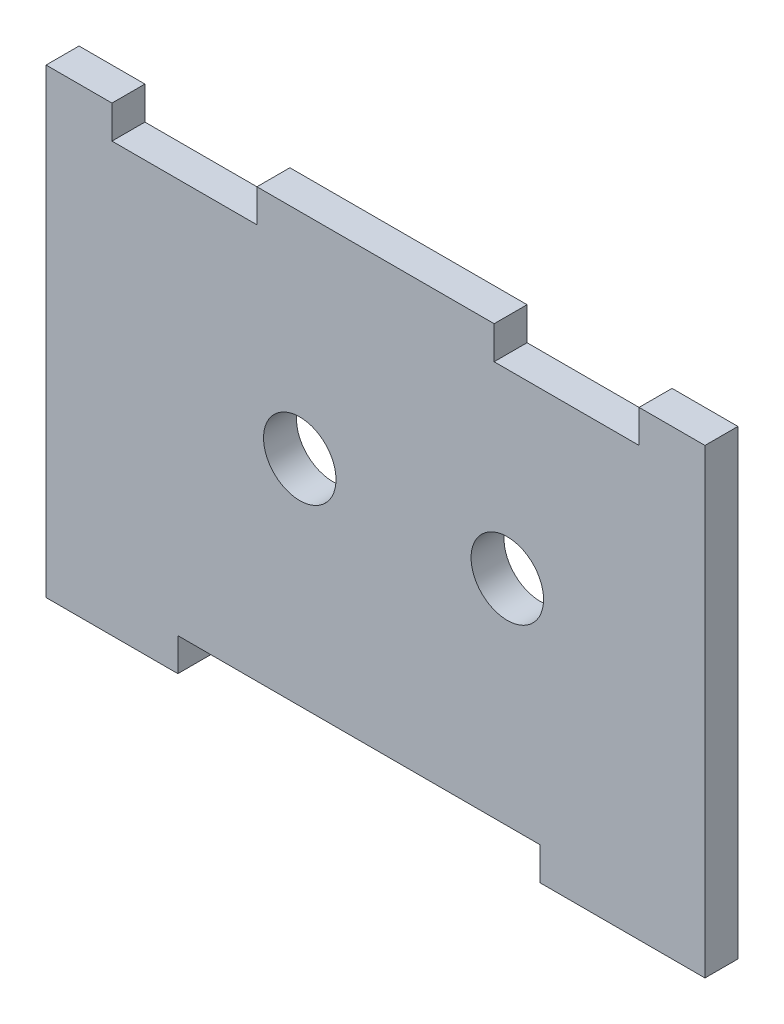
ISO-10303-21;
HEADER;
FILE_DESCRIPTION(('STEP AP214'),'2;1');
FILE_NAME('part.step','',(''),(''),'','','');
FILE_SCHEMA(('AUTOMOTIVE_DESIGN { 1 0 10303 214 1 1 1 1 }'));
ENDSEC;
DATA;
#1=APPLICATION_CONTEXT('core data for automotive mechanical design processes');
#2=APPLICATION_PROTOCOL_DEFINITION('international standard','automotive_design',2000,#1);
#3=PRODUCT_CONTEXT('',#1,'mechanical');
#4=PRODUCT('Part','Part','',(#3));
#5=PRODUCT_RELATED_PRODUCT_CATEGORY('part','',(#4));
#6=PRODUCT_DEFINITION_FORMATION('','',#4);
#7=PRODUCT_DEFINITION_CONTEXT('part definition',#1,'design');
#8=PRODUCT_DEFINITION('design','',#6,#7);
#9=PRODUCT_DEFINITION_SHAPE('','',#8);
#10=(LENGTH_UNIT() NAMED_UNIT(*) SI_UNIT(.MILLI.,.METRE.));
#11=(NAMED_UNIT(*) PLANE_ANGLE_UNIT() SI_UNIT($,.RADIAN.));
#12=(NAMED_UNIT(*) SI_UNIT($,.STERADIAN.) SOLID_ANGLE_UNIT());
#13=UNCERTAINTY_MEASURE_WITH_UNIT(LENGTH_MEASURE(1.E-05),#10,'distance_accuracy_value','');
#14=(GEOMETRIC_REPRESENTATION_CONTEXT(3) GLOBAL_UNCERTAINTY_ASSIGNED_CONTEXT((#13)) GLOBAL_UNIT_ASSIGNED_CONTEXT((#10,
#11,#12)) REPRESENTATION_CONTEXT('',''));
#15=CARTESIAN_POINT('',(0.,0.,0.));
#16=DIRECTION('',(0.,0.,1.));
#17=DIRECTION('',(1.,0.,0.));
#18=AXIS2_PLACEMENT_3D('',#15,#16,#17);
#19=CARTESIAN_POINT('',(0.,82.55,6.35));
#20=DIRECTION('',(0.,-1.,0.));
#21=DIRECTION('',(1.,0.,0.));
#22=AXIS2_PLACEMENT_3D('',#19,#20,#21);
#23=PLANE('',#22);
#24=DIRECTION('',(-1.,0.,0.));
#25=VECTOR('',#24,1.);
#26=CARTESIAN_POINT('',(0.,82.55,6.35));
#27=LINE('',#26,#25);
#28=CARTESIAN_POINT('',(-114.3,82.55,6.35));
#29=VERTEX_POINT('',#28);
#30=CARTESIAN_POINT('',(-127.,82.55,6.35));
#31=VERTEX_POINT('',#30);
#32=EDGE_CURVE('E183',#29,#31,#27,.T.);
#33=ORIENTED_EDGE('',*,*,#32,.F.);
#34=DIRECTION('',(0.,0.,-1.));
#35=VECTOR('',#34,1.);
#36=CARTESIAN_POINT('',(-114.3,82.55,6.35));
#37=LINE('',#36,#35);
#38=CARTESIAN_POINT('',(-114.3,82.55,0.));
#39=VERTEX_POINT('',#38);
#40=EDGE_CURVE('E166',#29,#39,#37,.T.);
#41=ORIENTED_EDGE('',*,*,#40,.T.);
#42=DIRECTION('',(-1.,0.,0.));
#43=VECTOR('',#42,1.);
#44=CARTESIAN_POINT('',(0.,82.55,0.));
#45=LINE('',#44,#43);
#46=CARTESIAN_POINT('',(-127.,82.55,0.));
#47=VERTEX_POINT('',#46);
#48=EDGE_CURVE('E302',#39,#47,#45,.T.);
#49=ORIENTED_EDGE('',*,*,#48,.T.);
#50=DIRECTION('',(0.,0.,-1.));
#51=VECTOR('',#50,1.);
#52=CARTESIAN_POINT('',(-127.,82.55,6.35));
#53=LINE('',#52,#51);
#54=EDGE_CURVE('E51',#31,#47,#53,.T.);
#55=ORIENTED_EDGE('',*,*,#54,.F.);
#56=EDGE_LOOP('',(#33,#41,#49,#55));
#57=FACE_BOUND('',#56,.T.);
#58=ADVANCED_FACE('F41',(#57),#23,.F.);
#59=CARTESIAN_POINT('',(0.,82.55,0.));
#60=VERTEX_POINT('',#59);
#61=CARTESIAN_POINT('',(-12.7,82.55,0.));
#62=VERTEX_POINT('',#61);
#63=EDGE_CURVE('E301',#60,#62,#45,.T.);
#64=ORIENTED_EDGE('',*,*,#63,.T.);
#65=DIRECTION('',(0.,0.,-1.));
#66=VECTOR('',#65,1.);
#67=CARTESIAN_POINT('',(-12.7,82.55,6.35));
#68=LINE('',#67,#66);
#69=CARTESIAN_POINT('',(-12.7,82.55,6.35));
#70=VERTEX_POINT('',#69);
#71=EDGE_CURVE('E344',#70,#62,#68,.T.);
#72=ORIENTED_EDGE('',*,*,#71,.F.);
#73=CARTESIAN_POINT('',(0.,82.55,6.35));
#74=VERTEX_POINT('',#73);
#75=EDGE_CURVE('E195',#74,#70,#27,.T.);
#76=ORIENTED_EDGE('',*,*,#75,.F.);
#77=DIRECTION('',(0.,0.,-1.));
#78=VECTOR('',#77,1.);
#79=CARTESIAN_POINT('',(0.,82.55,6.35));
#80=LINE('',#79,#78);
#81=EDGE_CURVE('E11',#74,#60,#80,.T.);
#82=ORIENTED_EDGE('',*,*,#81,.T.);
#83=EDGE_LOOP('',(#64,#72,#76,#82));
#84=FACE_BOUND('',#83,.T.);
#85=ADVANCED_FACE('F282',(#84),#23,.F.);
#86=CARTESIAN_POINT('',(-127.,0.,6.35));
#87=DIRECTION('',(0.,1.,0.));
#88=DIRECTION('',(0.,0.,1.));
#89=AXIS2_PLACEMENT_3D('',#86,#87,#88);
#90=PLANE('',#89);
#91=DIRECTION('',(1.,0.,0.));
#92=VECTOR('',#91,1.);
#93=CARTESIAN_POINT('',(-127.,0.,6.35));
#94=LINE('',#93,#92);
#95=CARTESIAN_POINT('',(-101.6,0.,6.35));
#96=VERTEX_POINT('',#95);
#97=CARTESIAN_POINT('',(-31.75,0.,6.35));
#98=VERTEX_POINT('',#97);
#99=EDGE_CURVE('E45',#96,#98,#94,.T.);
#100=ORIENTED_EDGE('',*,*,#99,.F.);
#101=DIRECTION('',(0.,0.,-1.));
#102=VECTOR('',#101,1.);
#103=CARTESIAN_POINT('',(-101.6,0.,6.35));
#104=LINE('',#103,#102);
#105=CARTESIAN_POINT('',(-101.6,0.,0.));
#106=VERTEX_POINT('',#105);
#107=EDGE_CURVE('E331',#96,#106,#104,.T.);
#108=ORIENTED_EDGE('',*,*,#107,.T.);
#109=DIRECTION('',(1.,0.,0.));
#110=VECTOR('',#109,1.);
#111=CARTESIAN_POINT('',(-127.,0.,0.));
#112=LINE('',#111,#110);
#113=CARTESIAN_POINT('',(-31.75,0.,0.));
#114=VERTEX_POINT('',#113);
#115=EDGE_CURVE('E216',#106,#114,#112,.T.);
#116=ORIENTED_EDGE('',*,*,#115,.T.);
#117=DIRECTION('',(0.,0.,-1.));
#118=VECTOR('',#117,1.);
#119=CARTESIAN_POINT('',(-31.75,0.,6.35));
#120=LINE('',#119,#118);
#121=EDGE_CURVE('E234',#98,#114,#120,.T.);
#122=ORIENTED_EDGE('',*,*,#121,.F.);
#123=EDGE_LOOP('',(#100,#108,#116,#122));
#124=FACE_BOUND('',#123,.T.);
#125=ADVANCED_FACE('F43',(#124),#90,.F.);
#126=CARTESIAN_POINT('',(0.,0.,6.35));
#127=DIRECTION('',(0.,0.,1.));
#128=DIRECTION('',(1.,0.,0.));
#129=AXIS2_PLACEMENT_3D('',#126,#127,#128);
#130=PLANE('',#129);
#131=DIRECTION('',(0.,1.,0.));
#132=VECTOR('',#131,1.);
#133=CARTESIAN_POINT('',(-114.3,82.55,6.35));
#134=LINE('',#133,#132);
#135=CARTESIAN_POINT('',(-114.3,76.2,6.35));
#136=VERTEX_POINT('',#135);
#137=EDGE_CURVE('E169',#136,#29,#134,.T.);
#138=ORIENTED_EDGE('',*,*,#137,.T.);
#139=ORIENTED_EDGE('',*,*,#32,.T.);
#140=DIRECTION('',(0.,-1.,0.));
#141=VECTOR('',#140,1.);
#142=CARTESIAN_POINT('',(-127.,82.55,6.35));
#143=LINE('',#142,#141);
#144=CARTESIAN_POINT('',(-127.,-6.35,6.35));
#145=VERTEX_POINT('',#144);
#146=EDGE_CURVE('E202',#31,#145,#143,.T.);
#147=ORIENTED_EDGE('',*,*,#146,.T.);
#148=DIRECTION('',(-1.,0.,0.));
#149=VECTOR('',#148,1.);
#150=CARTESIAN_POINT('',(-127.,-6.35,6.35));
#151=LINE('',#150,#149);
#152=CARTESIAN_POINT('',(-101.6,-6.35,6.35));
#153=VERTEX_POINT('',#152);
#154=EDGE_CURVE('E334',#153,#145,#151,.T.);
#155=ORIENTED_EDGE('',*,*,#154,.F.);
#156=DIRECTION('',(0.,-1.,0.));
#157=VECTOR('',#156,1.);
#158=CARTESIAN_POINT('',(-101.6,0.,6.35));
#159=LINE('',#158,#157);
#160=EDGE_CURVE('E317',#96,#153,#159,.T.);
#161=ORIENTED_EDGE('',*,*,#160,.F.);
#162=ORIENTED_EDGE('',*,*,#99,.T.);
#163=DIRECTION('',(0.,1.,0.));
#164=VECTOR('',#163,1.);
#165=CARTESIAN_POINT('',(-31.75,0.,6.35));
#166=LINE('',#165,#164);
#167=CARTESIAN_POINT('',(-31.75,-6.35,6.35));
#168=VERTEX_POINT('',#167);
#169=EDGE_CURVE('E222',#168,#98,#166,.T.);
#170=ORIENTED_EDGE('',*,*,#169,.F.);
#171=DIRECTION('',(-1.,0.,0.));
#172=VECTOR('',#171,1.);
#173=CARTESIAN_POINT('',(0.,-6.35,6.35));
#174=LINE('',#173,#172);
#175=CARTESIAN_POINT('',(0.,-6.35,6.35));
#176=VERTEX_POINT('',#175);
#177=EDGE_CURVE('E227',#176,#168,#174,.T.);
#178=ORIENTED_EDGE('',*,*,#177,.F.);
#179=DIRECTION('',(0.,1.,0.));
#180=VECTOR('',#179,1.);
#181=CARTESIAN_POINT('',(0.,0.,6.35));
#182=LINE('',#181,#180);
#183=EDGE_CURVE('E193',#176,#74,#182,.T.);
#184=ORIENTED_EDGE('',*,*,#183,.T.);
#185=ORIENTED_EDGE('',*,*,#75,.T.);
#186=DIRECTION('',(0.,-1.,0.));
#187=VECTOR('',#186,1.);
#188=CARTESIAN_POINT('',(-12.7,82.55,6.35));
#189=LINE('',#188,#187);
#190=CARTESIAN_POINT('',(-12.7,76.2,6.35));
#191=VERTEX_POINT('',#190);
#192=EDGE_CURVE('E357',#70,#191,#189,.T.);
#193=ORIENTED_EDGE('',*,*,#192,.T.);
#194=DIRECTION('',(-1.,0.,0.));
#195=VECTOR('',#194,1.);
#196=CARTESIAN_POINT('',(-12.7,76.2,6.35));
#197=LINE('',#196,#195);
#198=CARTESIAN_POINT('',(-40.64,76.2,6.35));
#199=VERTEX_POINT('',#198);
#200=EDGE_CURVE('E369',#191,#199,#197,.T.);
#201=ORIENTED_EDGE('',*,*,#200,.T.);
#202=DIRECTION('',(0.,1.,0.));
#203=VECTOR('',#202,1.);
#204=CARTESIAN_POINT('',(-40.64,82.55,6.35));
#205=LINE('',#204,#203);
#206=CARTESIAN_POINT('',(-40.64,82.55,6.35));
#207=VERTEX_POINT('',#206);
#208=EDGE_CURVE('E351',#199,#207,#205,.T.);
#209=ORIENTED_EDGE('',*,*,#208,.T.);
#210=CARTESIAN_POINT('',(-86.36,82.55,6.35));
#211=VERTEX_POINT('',#210);
#212=EDGE_CURVE('E192',#207,#211,#27,.T.);
#213=ORIENTED_EDGE('',*,*,#212,.T.);
#214=DIRECTION('',(0.,-1.,0.));
#215=VECTOR('',#214,1.);
#216=CARTESIAN_POINT('',(-86.36,82.55,6.35));
#217=LINE('',#216,#215);
#218=CARTESIAN_POINT('',(-86.36,76.2,6.35));
#219=VERTEX_POINT('',#218);
#220=EDGE_CURVE('E59',#211,#219,#217,.T.);
#221=ORIENTED_EDGE('',*,*,#220,.T.);
#222=DIRECTION('',(-1.,0.,0.));
#223=VECTOR('',#222,1.);
#224=CARTESIAN_POINT('',(-114.3,76.2,6.35));
#225=LINE('',#224,#223);
#226=EDGE_CURVE('E178',#219,#136,#225,.T.);
#227=ORIENTED_EDGE('',*,*,#226,.T.);
#228=EDGE_LOOP('',(#138,#139,#147,#155,#161,#162,#170,#178,#184,#185,#193,#201,#209,#213,#221,#227));
#229=FACE_BOUND('',#228,.T.);
#230=CARTESIAN_POINT('',(-38.1,41.275,6.35));
#231=DIRECTION('',(0.,0.,1.));
#232=DIRECTION('',(1.,0.,0.));
#233=AXIS2_PLACEMENT_3D('',#230,#231,#232);
#234=CIRCLE('',#233,6.985);
#235=CARTESIAN_POINT('',(-31.115,41.275,6.35));
#236=VERTEX_POINT('',#235);
#237=EDGE_CURVE('E219',#236,#236,#234,.T.);
#238=ORIENTED_EDGE('',*,*,#237,.F.);
#239=EDGE_LOOP('',(#238));
#240=FACE_BOUND('',#239,.T.);
#241=CARTESIAN_POINT('',(-78.105,41.275,6.35));
#242=DIRECTION('',(0.,0.,1.));
#243=DIRECTION('',(1.,0.,0.));
#244=AXIS2_PLACEMENT_3D('',#241,#242,#243);
#245=CIRCLE('',#244,6.98500000000001);
#246=CARTESIAN_POINT('',(-71.12,41.275,6.35));
#247=VERTEX_POINT('',#246);
#248=EDGE_CURVE('E247',#247,#247,#245,.T.);
#249=ORIENTED_EDGE('',*,*,#248,.F.);
#250=EDGE_LOOP('',(#249));
#251=FACE_BOUND('',#250,.T.);
#252=ADVANCED_FACE('F181',(#229,#240,#251),#130,.T.);
#253=CARTESIAN_POINT('',(0.,0.,0.));
#254=DIRECTION('',(0.,0.,1.));
#255=DIRECTION('',(1.,0.,0.));
#256=AXIS2_PLACEMENT_3D('',#253,#254,#255);
#257=PLANE('',#256);
#258=CARTESIAN_POINT('',(-38.1,41.275,0.));
#259=DIRECTION('',(0.,0.,1.));
#260=DIRECTION('',(1.,0.,0.));
#261=AXIS2_PLACEMENT_3D('',#258,#259,#260);
#262=CIRCLE('',#261,6.985);
#263=CARTESIAN_POINT('',(-31.115,41.275,0.));
#264=VERTEX_POINT('',#263);
#265=EDGE_CURVE('E251',#264,#264,#262,.T.);
#266=ORIENTED_EDGE('',*,*,#265,.T.);
#267=EDGE_LOOP('',(#266));
#268=FACE_BOUND('',#267,.T.);
#269=ORIENTED_EDGE('',*,*,#48,.F.);
#270=DIRECTION('',(0.,1.,0.));
#271=VECTOR('',#270,1.);
#272=CARTESIAN_POINT('',(-114.3,82.55,0.));
#273=LINE('',#272,#271);
#274=CARTESIAN_POINT('',(-114.3,76.2,0.));
#275=VERTEX_POINT('',#274);
#276=EDGE_CURVE('E172',#275,#39,#273,.T.);
#277=ORIENTED_EDGE('',*,*,#276,.F.);
#278=DIRECTION('',(-1.,0.,0.));
#279=VECTOR('',#278,1.);
#280=CARTESIAN_POINT('',(-114.3,76.2,0.));
#281=LINE('',#280,#279);
#282=CARTESIAN_POINT('',(-86.36,76.2,0.));
#283=VERTEX_POINT('',#282);
#284=EDGE_CURVE('E187',#283,#275,#281,.T.);
#285=ORIENTED_EDGE('',*,*,#284,.F.);
#286=DIRECTION('',(0.,-1.,0.));
#287=VECTOR('',#286,1.);
#288=CARTESIAN_POINT('',(-86.36,82.55,0.));
#289=LINE('',#288,#287);
#290=CARTESIAN_POINT('',(-86.36,82.55,0.));
#291=VERTEX_POINT('',#290);
#292=EDGE_CURVE('E382',#291,#283,#289,.T.);
#293=ORIENTED_EDGE('',*,*,#292,.F.);
#294=CARTESIAN_POINT('',(-40.64,82.55,0.));
#295=VERTEX_POINT('',#294);
#296=EDGE_CURVE('E297',#295,#291,#45,.T.);
#297=ORIENTED_EDGE('',*,*,#296,.F.);
#298=DIRECTION('',(0.,1.,0.));
#299=VECTOR('',#298,1.);
#300=CARTESIAN_POINT('',(-40.64,82.55,0.));
#301=LINE('',#300,#299);
#302=CARTESIAN_POINT('',(-40.64,76.2,0.));
#303=VERTEX_POINT('',#302);
#304=EDGE_CURVE('E67',#303,#295,#301,.T.);
#305=ORIENTED_EDGE('',*,*,#304,.F.);
#306=DIRECTION('',(-1.,0.,0.));
#307=VECTOR('',#306,1.);
#308=CARTESIAN_POINT('',(-12.7,76.2,0.));
#309=LINE('',#308,#307);
#310=CARTESIAN_POINT('',(-12.7,76.2,0.));
#311=VERTEX_POINT('',#310);
#312=EDGE_CURVE('E358',#311,#303,#309,.T.);
#313=ORIENTED_EDGE('',*,*,#312,.F.);
#314=DIRECTION('',(0.,-1.,0.));
#315=VECTOR('',#314,1.);
#316=CARTESIAN_POINT('',(-12.7,82.55,0.));
#317=LINE('',#316,#315);
#318=EDGE_CURVE('E362',#62,#311,#317,.T.);
#319=ORIENTED_EDGE('',*,*,#318,.F.);
#320=ORIENTED_EDGE('',*,*,#63,.F.);
#321=DIRECTION('',(0.,1.,0.));
#322=VECTOR('',#321,1.);
#323=CARTESIAN_POINT('',(0.,0.,0.));
#324=LINE('',#323,#322);
#325=CARTESIAN_POINT('',(0.,-6.35,0.));
#326=VERTEX_POINT('',#325);
#327=EDGE_CURVE('E214',#326,#60,#324,.T.);
#328=ORIENTED_EDGE('',*,*,#327,.F.);
#329=DIRECTION('',(-1.,0.,0.));
#330=VECTOR('',#329,1.);
#331=CARTESIAN_POINT('',(0.,-6.35,0.));
#332=LINE('',#331,#330);
#333=CARTESIAN_POINT('',(-31.75,-6.35,0.));
#334=VERTEX_POINT('',#333);
#335=EDGE_CURVE('E233',#326,#334,#332,.T.);
#336=ORIENTED_EDGE('',*,*,#335,.T.);
#337=DIRECTION('',(0.,1.,0.));
#338=VECTOR('',#337,1.);
#339=CARTESIAN_POINT('',(-31.75,0.,0.));
#340=LINE('',#339,#338);
#341=EDGE_CURVE('E230',#334,#114,#340,.T.);
#342=ORIENTED_EDGE('',*,*,#341,.T.);
#343=ORIENTED_EDGE('',*,*,#115,.F.);
#344=DIRECTION('',(0.,-1.,0.));
#345=VECTOR('',#344,1.);
#346=CARTESIAN_POINT('',(-101.6,0.,0.));
#347=LINE('',#346,#345);
#348=CARTESIAN_POINT('',(-101.6,-6.35,0.));
#349=VERTEX_POINT('',#348);
#350=EDGE_CURVE('E341',#106,#349,#347,.T.);
#351=ORIENTED_EDGE('',*,*,#350,.T.);
#352=DIRECTION('',(-1.,0.,0.));
#353=VECTOR('',#352,1.);
#354=CARTESIAN_POINT('',(-127.,-6.35,0.));
#355=LINE('',#354,#353);
#356=CARTESIAN_POINT('',(-127.,-6.35,0.));
#357=VERTEX_POINT('',#356);
#358=EDGE_CURVE('E338',#349,#357,#355,.T.);
#359=ORIENTED_EDGE('',*,*,#358,.T.);
#360=DIRECTION('',(0.,-1.,0.));
#361=VECTOR('',#360,1.);
#362=CARTESIAN_POINT('',(-127.,82.55,0.));
#363=LINE('',#362,#361);
#364=EDGE_CURVE('E304',#47,#357,#363,.T.);
#365=ORIENTED_EDGE('',*,*,#364,.F.);
#366=EDGE_LOOP('',(#269,#277,#285,#293,#297,#305,#313,#319,#320,#328,#336,#342,#343,#351,#359,#365));
#367=FACE_BOUND('',#366,.T.);
#368=CARTESIAN_POINT('',(-78.105,41.275,0.));
#369=DIRECTION('',(0.,0.,1.));
#370=DIRECTION('',(1.,0.,0.));
#371=AXIS2_PLACEMENT_3D('',#368,#369,#370);
#372=CIRCLE('',#371,6.98500000000001);
#373=CARTESIAN_POINT('',(-71.12,41.275,0.));
#374=VERTEX_POINT('',#373);
#375=EDGE_CURVE('E237',#374,#374,#372,.T.);
#376=ORIENTED_EDGE('',*,*,#375,.T.);
#377=EDGE_LOOP('',(#376));
#378=FACE_BOUND('',#377,.T.);
#379=ADVANCED_FACE('F261',(#268,#367,#378),#257,.F.);
#380=CARTESIAN_POINT('',(0.,0.,6.35));
#381=DIRECTION('',(-1.,0.,0.));
#382=DIRECTION('',(0.,0.,1.));
#383=AXIS2_PLACEMENT_3D('',#380,#381,#382);
#384=PLANE('',#383);
#385=ORIENTED_EDGE('',*,*,#327,.T.);
#386=ORIENTED_EDGE('',*,*,#81,.F.);
#387=ORIENTED_EDGE('',*,*,#183,.F.);
#388=DIRECTION('',(0.,0.,-1.));
#389=VECTOR('',#388,1.);
#390=CARTESIAN_POINT('',(0.,-6.35,6.35));
#391=LINE('',#390,#389);
#392=EDGE_CURVE('E226',#176,#326,#391,.T.);
#393=ORIENTED_EDGE('',*,*,#392,.T.);
#394=EDGE_LOOP('',(#385,#386,#387,#393));
#395=FACE_BOUND('',#394,.T.);
#396=ADVANCED_FACE('F289',(#395),#384,.F.);
#397=ORIENTED_EDGE('',*,*,#296,.T.);
#398=DIRECTION('',(0.,0.,-1.));
#399=VECTOR('',#398,1.);
#400=CARTESIAN_POINT('',(-86.36,82.55,6.35));
#401=LINE('',#400,#399);
#402=EDGE_CURVE('E177',#211,#291,#401,.T.);
#403=ORIENTED_EDGE('',*,*,#402,.F.);
#404=ORIENTED_EDGE('',*,*,#212,.F.);
#405=DIRECTION('',(0.,0.,-1.));
#406=VECTOR('',#405,1.);
#407=CARTESIAN_POINT('',(-40.64,82.55,6.35));
#408=LINE('',#407,#406);
#409=EDGE_CURVE('E299',#207,#295,#408,.T.);
#410=ORIENTED_EDGE('',*,*,#409,.T.);
#411=EDGE_LOOP('',(#397,#403,#404,#410));
#412=FACE_BOUND('',#411,.T.);
#413=ADVANCED_FACE('F277',(#412),#23,.F.);
#414=CARTESIAN_POINT('',(-127.,82.55,6.35));
#415=DIRECTION('',(1.,0.,0.));
#416=DIRECTION('',(0.,1.,0.));
#417=AXIS2_PLACEMENT_3D('',#414,#415,#416);
#418=PLANE('',#417);
#419=ORIENTED_EDGE('',*,*,#364,.T.);
#420=DIRECTION('',(0.,0.,-1.));
#421=VECTOR('',#420,1.);
#422=CARTESIAN_POINT('',(-127.,-6.35,6.35));
#423=LINE('',#422,#421);
#424=EDGE_CURVE('E336',#145,#357,#423,.T.);
#425=ORIENTED_EDGE('',*,*,#424,.F.);
#426=ORIENTED_EDGE('',*,*,#146,.F.);
#427=ORIENTED_EDGE('',*,*,#54,.T.);
#428=EDGE_LOOP('',(#419,#425,#426,#427));
#429=FACE_BOUND('',#428,.T.);
#430=ADVANCED_FACE('F267',(#429),#418,.F.);
#431=CARTESIAN_POINT('',(-38.1,41.275,6.35));
#432=DIRECTION('',(0.,0.,-1.));
#433=DIRECTION('',(-1.,0.,0.));
#434=AXIS2_PLACEMENT_3D('',#431,#432,#433);
#435=CYLINDRICAL_SURFACE('',#434,6.985);
#436=ORIENTED_EDGE('',*,*,#237,.T.);
#437=EDGE_LOOP('',(#436));
#438=FACE_BOUND('',#437,.T.);
#439=ORIENTED_EDGE('',*,*,#265,.F.);
#440=EDGE_LOOP('',(#439));
#441=FACE_BOUND('',#440,.T.);
#442=ADVANCED_FACE('F264',(#438,#441),#435,.F.);
#443=CARTESIAN_POINT('',(-78.105,41.275,6.35));
#444=DIRECTION('',(0.,0.,-1.));
#445=DIRECTION('',(-1.,0.,0.));
#446=AXIS2_PLACEMENT_3D('',#443,#444,#445);
#447=CYLINDRICAL_SURFACE('',#446,6.98500000000001);
#448=ORIENTED_EDGE('',*,*,#248,.T.);
#449=EDGE_LOOP('',(#448));
#450=FACE_BOUND('',#449,.T.);
#451=ORIENTED_EDGE('',*,*,#375,.F.);
#452=EDGE_LOOP('',(#451));
#453=FACE_BOUND('',#452,.T.);
#454=ADVANCED_FACE('F266',(#450,#453),#447,.F.);
#455=CARTESIAN_POINT('',(-31.75,0.,6.35));
#456=DIRECTION('',(-1.,0.,0.));
#457=DIRECTION('',(0.,0.,1.));
#458=AXIS2_PLACEMENT_3D('',#455,#456,#457);
#459=PLANE('',#458);
#460=ORIENTED_EDGE('',*,*,#341,.F.);
#461=DIRECTION('',(0.,0.,-1.));
#462=VECTOR('',#461,1.);
#463=CARTESIAN_POINT('',(-31.75,-6.35,6.35));
#464=LINE('',#463,#462);
#465=EDGE_CURVE('E238',#168,#334,#464,.T.);
#466=ORIENTED_EDGE('',*,*,#465,.F.);
#467=ORIENTED_EDGE('',*,*,#169,.T.);
#468=ORIENTED_EDGE('',*,*,#121,.T.);
#469=EDGE_LOOP('',(#460,#466,#467,#468));
#470=FACE_BOUND('',#469,.T.);
#471=ADVANCED_FACE('F274',(#470),#459,.T.);
#472=CARTESIAN_POINT('',(0.,-6.35,6.35));
#473=DIRECTION('',(0.,-1.,0.));
#474=DIRECTION('',(0.,0.,-1.));
#475=AXIS2_PLACEMENT_3D('',#472,#473,#474);
#476=PLANE('',#475);
#477=ORIENTED_EDGE('',*,*,#335,.F.);
#478=ORIENTED_EDGE('',*,*,#392,.F.);
#479=ORIENTED_EDGE('',*,*,#177,.T.);
#480=ORIENTED_EDGE('',*,*,#465,.T.);
#481=EDGE_LOOP('',(#477,#478,#479,#480));
#482=FACE_BOUND('',#481,.T.);
#483=ADVANCED_FACE('F326',(#482),#476,.T.);
#484=CARTESIAN_POINT('',(-127.,-6.35,6.35));
#485=DIRECTION('',(0.,-1.,0.));
#486=DIRECTION('',(1.,0.,0.));
#487=AXIS2_PLACEMENT_3D('',#484,#485,#486);
#488=PLANE('',#487);
#489=ORIENTED_EDGE('',*,*,#358,.F.);
#490=DIRECTION('',(0.,0.,-1.));
#491=VECTOR('',#490,1.);
#492=CARTESIAN_POINT('',(-101.6,-6.35,6.35));
#493=LINE('',#492,#491);
#494=EDGE_CURVE('E333',#153,#349,#493,.T.);
#495=ORIENTED_EDGE('',*,*,#494,.F.);
#496=ORIENTED_EDGE('',*,*,#154,.T.);
#497=ORIENTED_EDGE('',*,*,#424,.T.);
#498=EDGE_LOOP('',(#489,#495,#496,#497));
#499=FACE_BOUND('',#498,.T.);
#500=ADVANCED_FACE('F497',(#499),#488,.T.);
#501=CARTESIAN_POINT('',(-101.6,0.,6.35));
#502=DIRECTION('',(1.,0.,0.));
#503=DIRECTION('',(0.,0.,-1.));
#504=AXIS2_PLACEMENT_3D('',#501,#502,#503);
#505=PLANE('',#504);
#506=ORIENTED_EDGE('',*,*,#350,.F.);
#507=ORIENTED_EDGE('',*,*,#107,.F.);
#508=ORIENTED_EDGE('',*,*,#160,.T.);
#509=ORIENTED_EDGE('',*,*,#494,.T.);
#510=EDGE_LOOP('',(#506,#507,#508,#509));
#511=FACE_BOUND('',#510,.T.);
#512=ADVANCED_FACE('F447',(#511),#505,.T.);
#513=CARTESIAN_POINT('',(-12.7,82.55,6.35));
#514=DIRECTION('',(1.,0.,0.));
#515=DIRECTION('',(0.,1.,0.));
#516=AXIS2_PLACEMENT_3D('',#513,#514,#515);
#517=PLANE('',#516);
#518=ORIENTED_EDGE('',*,*,#318,.T.);
#519=DIRECTION('',(0.,0.,-1.));
#520=VECTOR('',#519,1.);
#521=CARTESIAN_POINT('',(-12.7,76.2,6.35));
#522=LINE('',#521,#520);
#523=EDGE_CURVE('E348',#191,#311,#522,.T.);
#524=ORIENTED_EDGE('',*,*,#523,.F.);
#525=ORIENTED_EDGE('',*,*,#192,.F.);
#526=ORIENTED_EDGE('',*,*,#71,.T.);
#527=EDGE_LOOP('',(#518,#524,#525,#526));
#528=FACE_BOUND('',#527,.T.);
#529=ADVANCED_FACE('F442',(#528),#517,.F.);
#530=CARTESIAN_POINT('',(-40.64,82.55,6.35));
#531=DIRECTION('',(-1.,0.,0.));
#532=DIRECTION('',(0.,0.,1.));
#533=AXIS2_PLACEMENT_3D('',#530,#531,#532);
#534=PLANE('',#533);
#535=ORIENTED_EDGE('',*,*,#304,.T.);
#536=ORIENTED_EDGE('',*,*,#409,.F.);
#537=ORIENTED_EDGE('',*,*,#208,.F.);
#538=DIRECTION('',(0.,0.,-1.));
#539=VECTOR('',#538,1.);
#540=CARTESIAN_POINT('',(-40.64,76.2,6.35));
#541=LINE('',#540,#539);
#542=EDGE_CURVE('E350',#199,#303,#541,.T.);
#543=ORIENTED_EDGE('',*,*,#542,.T.);
#544=EDGE_LOOP('',(#535,#536,#537,#543));
#545=FACE_BOUND('',#544,.T.);
#546=ADVANCED_FACE('F390',(#545),#534,.F.);
#547=CARTESIAN_POINT('',(-12.7,76.2,6.35));
#548=DIRECTION('',(0.,-1.,0.));
#549=DIRECTION('',(0.,0.,-1.));
#550=AXIS2_PLACEMENT_3D('',#547,#548,#549);
#551=PLANE('',#550);
#552=ORIENTED_EDGE('',*,*,#312,.T.);
#553=ORIENTED_EDGE('',*,*,#542,.F.);
#554=ORIENTED_EDGE('',*,*,#200,.F.);
#555=ORIENTED_EDGE('',*,*,#523,.T.);
#556=EDGE_LOOP('',(#552,#553,#554,#555));
#557=FACE_BOUND('',#556,.T.);
#558=ADVANCED_FACE('F393',(#557),#551,.F.);
#559=CARTESIAN_POINT('',(-114.3,82.55,6.35));
#560=DIRECTION('',(-1.,0.,0.));
#561=DIRECTION('',(0.,0.,1.));
#562=AXIS2_PLACEMENT_3D('',#559,#560,#561);
#563=PLANE('',#562);
#564=ORIENTED_EDGE('',*,*,#276,.T.);
#565=ORIENTED_EDGE('',*,*,#40,.F.);
#566=ORIENTED_EDGE('',*,*,#137,.F.);
#567=DIRECTION('',(0.,0.,-1.));
#568=VECTOR('',#567,1.);
#569=CARTESIAN_POINT('',(-114.3,76.2,6.35));
#570=LINE('',#569,#568);
#571=EDGE_CURVE('E365',#136,#275,#570,.T.);
#572=ORIENTED_EDGE('',*,*,#571,.T.);
#573=EDGE_LOOP('',(#564,#565,#566,#572));
#574=FACE_BOUND('',#573,.T.);
#575=ADVANCED_FACE('F168',(#574),#563,.F.);
#576=CARTESIAN_POINT('',(-114.3,76.2,6.35));
#577=DIRECTION('',(0.,-1.,0.));
#578=DIRECTION('',(0.,0.,-1.));
#579=AXIS2_PLACEMENT_3D('',#576,#577,#578);
#580=PLANE('',#579);
#581=ORIENTED_EDGE('',*,*,#284,.T.);
#582=ORIENTED_EDGE('',*,*,#571,.F.);
#583=ORIENTED_EDGE('',*,*,#226,.F.);
#584=DIRECTION('',(0.,0.,-1.));
#585=VECTOR('',#584,1.);
#586=CARTESIAN_POINT('',(-86.36,76.2,6.35));
#587=LINE('',#586,#585);
#588=EDGE_CURVE('E375',#219,#283,#587,.T.);
#589=ORIENTED_EDGE('',*,*,#588,.T.);
#590=EDGE_LOOP('',(#581,#582,#583,#589));
#591=FACE_BOUND('',#590,.T.);
#592=ADVANCED_FACE('F474',(#591),#580,.F.);
#593=CARTESIAN_POINT('',(-86.36,82.55,6.35));
#594=DIRECTION('',(1.,0.,0.));
#595=DIRECTION('',(0.,0.,-1.));
#596=AXIS2_PLACEMENT_3D('',#593,#594,#595);
#597=PLANE('',#596);
#598=ORIENTED_EDGE('',*,*,#292,.T.);
#599=ORIENTED_EDGE('',*,*,#588,.F.);
#600=ORIENTED_EDGE('',*,*,#220,.F.);
#601=ORIENTED_EDGE('',*,*,#402,.T.);
#602=EDGE_LOOP('',(#598,#599,#600,#601));
#603=FACE_BOUND('',#602,.T.);
#604=ADVANCED_FACE('F483',(#603),#597,.F.);
#605=CLOSED_SHELL('',(#58,#85,#125,#252,#379,#396,#413,#430,#442,#454,#471,#483,#500,#512,#529,
#546,#558,#575,#592,#604));
#606=MANIFOLD_SOLID_BREP('B2',#605);
#607=ADVANCED_BREP_SHAPE_REPRESENTATION('',(#18,#606),#14);
#608=SHAPE_DEFINITION_REPRESENTATION(#9,#607);
ENDSEC;
END-ISO-10303-21;
